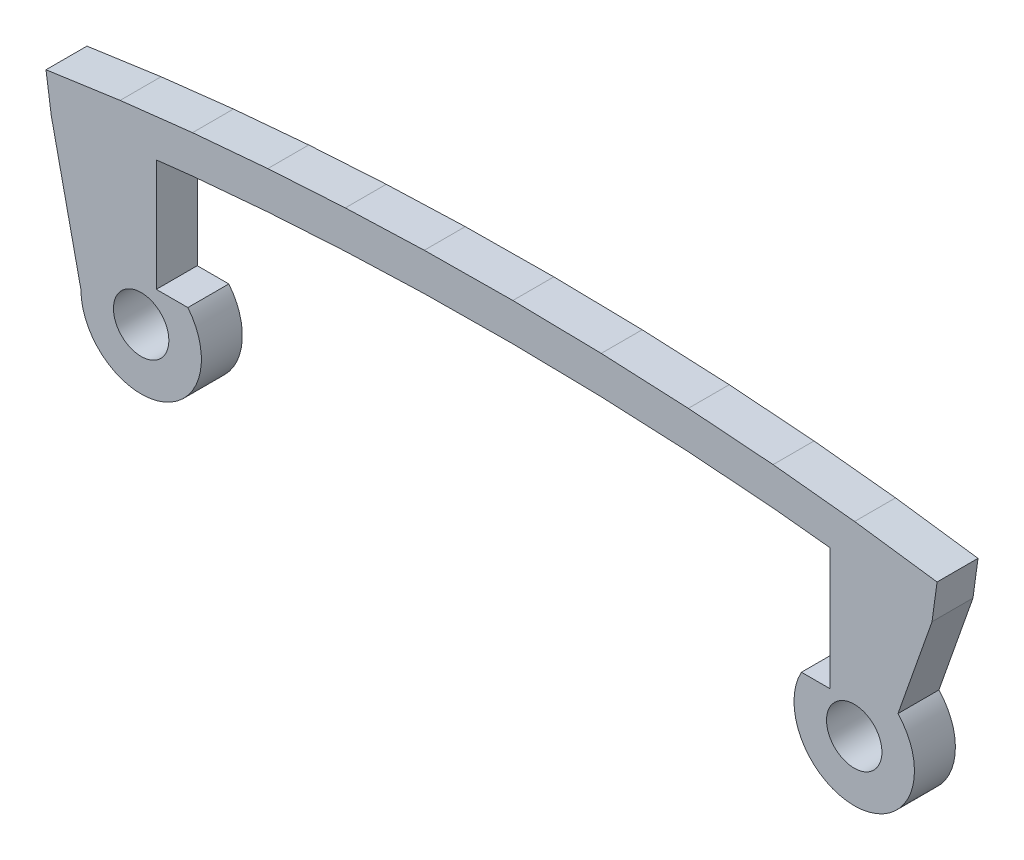
ISO-10303-21;
HEADER;
FILE_DESCRIPTION(('STEP AP214'),'2;1');
FILE_NAME('part.step','',(''),(''),'','','');
FILE_SCHEMA(('AUTOMOTIVE_DESIGN { 1 0 10303 214 1 1 1 1 }'));
ENDSEC;
DATA;
#1=APPLICATION_CONTEXT('core data for automotive mechanical design processes');
#2=APPLICATION_PROTOCOL_DEFINITION('international standard','automotive_design',2000,#1);
#3=PRODUCT_CONTEXT('',#1,'mechanical');
#4=PRODUCT('Part','Part','',(#3));
#5=PRODUCT_RELATED_PRODUCT_CATEGORY('part','',(#4));
#6=PRODUCT_DEFINITION_FORMATION('','',#4);
#7=PRODUCT_DEFINITION_CONTEXT('part definition',#1,'design');
#8=PRODUCT_DEFINITION('design','',#6,#7);
#9=PRODUCT_DEFINITION_SHAPE('','',#8);
#10=(LENGTH_UNIT() NAMED_UNIT(*) SI_UNIT(.MILLI.,.METRE.));
#11=(NAMED_UNIT(*) PLANE_ANGLE_UNIT() SI_UNIT($,.RADIAN.));
#12=(NAMED_UNIT(*) SI_UNIT($,.STERADIAN.) SOLID_ANGLE_UNIT());
#13=UNCERTAINTY_MEASURE_WITH_UNIT(LENGTH_MEASURE(1.E-05),#10,'distance_accuracy_value','');
#14=(GEOMETRIC_REPRESENTATION_CONTEXT(3) GLOBAL_UNCERTAINTY_ASSIGNED_CONTEXT((#13)) GLOBAL_UNIT_ASSIGNED_CONTEXT((#10,
#11,#12)) REPRESENTATION_CONTEXT('',''));
#15=CARTESIAN_POINT('',(0.,0.,0.));
#16=DIRECTION('',(0.,0.,1.));
#17=DIRECTION('',(1.,0.,0.));
#18=AXIS2_PLACEMENT_3D('',#15,#16,#17);
#19=CARTESIAN_POINT('',(-0.123345265688871,139.605502796736,161.523243341977));
#20=DIRECTION('',(0.,0.,1.));
#21=DIRECTION('',(1.,0.,0.));
#22=AXIS2_PLACEMENT_3D('',#19,#20,#21);
#23=PLANE('',#22);
#24=CARTESIAN_POINT('',(-0.123345265688871,139.605502796736,161.523243341977));
#25=DIRECTION('',(0.,0.,1.));
#26=DIRECTION('',(1.,0.,0.));
#27=AXIS2_PLACEMENT_3D('',#24,#25,#26);
#28=CIRCLE('',#27,1.15000024000001);
#29=CARTESIAN_POINT('',(1.02665497431114,139.605502796736,161.523243341977));
#30=VERTEX_POINT('',#29);
#31=EDGE_CURVE('E264',#30,#30,#28,.T.);
#32=ORIENTED_EDGE('',*,*,#31,.F.);
#33=EDGE_LOOP('',(#32));
#34=FACE_BOUND('',#33,.T.);
#35=CARTESIAN_POINT('',(-0.123345265688871,139.605502796736,161.523243341977));
#36=DIRECTION('',(0.,0.,1.));
#37=DIRECTION('',(1.,0.,0.));
#38=AXIS2_PLACEMENT_3D('',#35,#36,#37);
#39=CIRCLE('',#38,2.5);
#40=CARTESIAN_POINT('',(-2.31401490003765,140.810063527103,161.523243341977));
#41=VERTEX_POINT('',#40);
#42=CARTESIAN_POINT('',(1.69187692785862,141.324504945674,161.523243341977));
#43=VERTEX_POINT('',#42);
#44=EDGE_CURVE('E158',#41,#43,#39,.T.);
#45=ORIENTED_EDGE('',*,*,#44,.T.);
#46=DIRECTION('',(0.332723228899227,0.943024524045304,0.));
#47=VECTOR('',#46,1.);
#48=CARTESIAN_POINT('',(1.69187692785862,141.324504945674,161.523243341977));
#49=LINE('',#48,#47);
#50=CARTESIAN_POINT('',(3.10767961017012,145.337259495592,161.523243341977));
#51=VERTEX_POINT('',#50);
#52=EDGE_CURVE('E480',#43,#51,#49,.T.);
#53=ORIENTED_EDGE('',*,*,#52,.T.);
#54=DIRECTION('',(0.134081495211112,0.990970308658111,0.));
#55=VECTOR('',#54,1.);
#56=CARTESIAN_POINT('',(3.31491302084713,146.868881414183,161.523243341977));
#57=LINE('',#56,#55);
#58=CARTESIAN_POINT('',(3.31491302084713,146.868881414183,161.523243341977));
#59=VERTEX_POINT('',#58);
#60=EDGE_CURVE('E404',#51,#59,#57,.T.);
#61=ORIENTED_EDGE('',*,*,#60,.T.);
#62=DIRECTION('',(-0.990970308658111,0.134081495211111,0.));
#63=VECTOR('',#62,1.);
#64=CARTESIAN_POINT('',(-0.107320542417873,147.331920709221,161.523243341977));
#65=LINE('',#64,#63);
#66=CARTESIAN_POINT('',(-0.107320542417873,147.331920709221,161.523243341977));
#67=VERTEX_POINT('',#66);
#68=EDGE_CURVE('E422',#59,#67,#65,.T.);
#69=ORIENTED_EDGE('',*,*,#68,.T.);
#70=DIRECTION('',(-0.994603246043685,0.103751544370985,0.));
#71=VECTOR('',#70,1.);
#72=CARTESIAN_POINT('',(-1.12852764959982,147.438447422173,161.523243341977));
#73=LINE('',#72,#71);
#74=CARTESIAN_POINT('',(-3.49131941326687,147.684920873253,161.523243341977));
#75=VERTEX_POINT('',#74);
#76=EDGE_CURVE('E419',#67,#75,#73,.T.);
#77=ORIENTED_EDGE('',*,*,#76,.T.);
#78=DIRECTION('',(-0.997218826776755,0.0745292662112883,0.));
#79=VECTOR('',#78,1.);
#80=CARTESIAN_POINT('',(-7.01032042034687,147.947920884697,161.523243341977));
#81=LINE('',#80,#79);
#82=CARTESIAN_POINT('',(-7.01032042034687,147.947920884697,161.523243341977));
#83=VERTEX_POINT('',#82);
#84=EDGE_CURVE('E421',#75,#83,#81,.T.);
#85=ORIENTED_EDGE('',*,*,#84,.T.);
#86=DIRECTION('',(-0.998921870718915,0.046423013683116,0.));
#87=VECTOR('',#86,1.);
#88=CARTESIAN_POINT('',(-10.6253182841169,148.115921105949,161.523243341977));
#89=LINE('',#88,#87);
#90=CARTESIAN_POINT('',(-10.6253182841169,148.115921105949,161.523243341977));
#91=VERTEX_POINT('',#90);
#92=EDGE_CURVE('E424',#83,#91,#89,.T.);
#93=ORIENTED_EDGE('',*,*,#92,.T.);
#94=DIRECTION('',(-0.999828203436329,0.0185354690602007,0.));
#95=VECTOR('',#94,1.);
#96=CARTESIAN_POINT('',(-14.2933213663919,148.183920945732,161.523243341977));
#97=LINE('',#96,#95);
#98=CARTESIAN_POINT('',(-14.2933213663919,148.183920945732,161.523243341977));
#99=VERTEX_POINT('',#98);
#100=EDGE_CURVE('E430',#91,#99,#97,.T.);
#101=ORIENTED_EDGE('',*,*,#100,.T.);
#102=DIRECTION('',(-0.999959729721886,-0.0089743486968982,0.));
#103=VECTOR('',#102,1.);
#104=CARTESIAN_POINT('',(-17.9703195048199,148.150920953361,161.523243341977));
#105=LINE('',#104,#103);
#106=CARTESIAN_POINT('',(-17.9703195048199,148.150920953361,161.523243341977));
#107=VERTEX_POINT('',#106);
#108=EDGE_CURVE('E432',#99,#107,#105,.T.);
#109=ORIENTED_EDGE('',*,*,#108,.T.);
#110=DIRECTION('',(-0.999364017189702,-0.0356589560483776,0.));
#111=VECTOR('',#110,1.);
#112=CARTESIAN_POINT('',(-21.2493188334329,148.033920850365,161.523243341977));
#113=LINE('',#112,#111);
#114=CARTESIAN_POINT('',(-21.2493188334329,148.033920850365,161.523243341977));
#115=VERTEX_POINT('',#114);
#116=EDGE_CURVE('E434',#107,#115,#113,.T.);
#117=ORIENTED_EDGE('',*,*,#116,.T.);
#118=DIRECTION('',(-0.998167926705539,-0.0605044634416733,0.));
#119=VECTOR('',#118,1.);
#120=CARTESIAN_POINT('',(-24.4663197947369,147.838920678703,161.523243341977));
#121=LINE('',#120,#119);
#122=CARTESIAN_POINT('',(-24.4663197947369,147.838920678703,161.523243341977));
#123=VERTEX_POINT('',#122);
#124=EDGE_CURVE('E436',#115,#123,#121,.T.);
#125=ORIENTED_EDGE('',*,*,#124,.T.);
#126=DIRECTION('',(-0.996260899689949,-0.0863957160336895,0.));
#127=VECTOR('',#126,1.);
#128=CARTESIAN_POINT('',(-27.5913197947369,147.567920770256,161.523243341977));
#129=LINE('',#128,#127);
#130=CARTESIAN_POINT('',(-27.5913197947369,147.567920770256,161.523243341977));
#131=VERTEX_POINT('',#130);
#132=EDGE_CURVE('E438',#123,#131,#129,.T.);
#133=ORIENTED_EDGE('',*,*,#132,.T.);
#134=DIRECTION('',(-0.993585854220757,-0.113080282509412,0.));
#135=VECTOR('',#134,1.);
#136=CARTESIAN_POINT('',(-29.0938203287944,147.396920766442,161.523243341977));
#137=LINE('',#136,#135);
#138=CARTESIAN_POINT('',(-30.5963208628519,147.225920762627,161.523243341977));
#139=VERTEX_POINT('',#138);
#140=EDGE_CURVE('E440',#131,#139,#137,.T.);
#141=ORIENTED_EDGE('',*,*,#140,.T.);
#142=DIRECTION('',(-0.990073741432097,-0.140548875935203,0.));
#143=VECTOR('',#142,1.);
#144=CARTESIAN_POINT('',(-33.6733522826868,146.789111574405,161.523243341977));
#145=LINE('',#144,#143);
#146=CARTESIAN_POINT('',(-33.6733522826868,146.789111574405,161.523243341977));
#147=VERTEX_POINT('',#146);
#148=EDGE_CURVE('E442',#139,#147,#145,.T.);
#149=ORIENTED_EDGE('',*,*,#148,.T.);
#150=DIRECTION('',(0.140548875935203,-0.990073741432097,0.));
#151=VECTOR('',#150,1.);
#152=CARTESIAN_POINT('',(-33.4563195658549,145.260259831286,161.523243341977));
#153=LINE('',#152,#151);
#154=CARTESIAN_POINT('',(-33.4563195658549,145.260259831286,161.523243341977));
#155=VERTEX_POINT('',#154);
#156=EDGE_CURVE('E444',#147,#155,#153,.T.);
#157=ORIENTED_EDGE('',*,*,#156,.T.);
#158=DIRECTION('',(0.213039695138311,-0.977043544728368,0.));
#159=VECTOR('',#158,1.);
#160=CARTESIAN_POINT('',(-32.2233267056885,139.605502796736,161.523243341977));
#161=LINE('',#160,#159);
#162=CARTESIAN_POINT('',(-32.2233267056885,139.605502796736,161.523243341977));
#163=VERTEX_POINT('',#162);
#164=EDGE_CURVE('E446',#155,#163,#161,.T.);
#165=ORIENTED_EDGE('',*,*,#164,.T.);
#166=CARTESIAN_POINT('',(-29.7233267056889,139.605502796736,161.523243341977));
#167=DIRECTION('',(0.,0.,1.));
#168=DIRECTION('',(1.,0.,0.));
#169=AXIS2_PLACEMENT_3D('',#166,#167,#168);
#170=CIRCLE('',#169,2.50000000000026);
#171=CARTESIAN_POINT('',(-27.7845621351529,141.183853816007,161.523243341977));
#172=VERTEX_POINT('',#171);
#173=EDGE_CURVE('E448',#163,#172,#170,.T.);
#174=ORIENTED_EDGE('',*,*,#173,.T.);
#175=DIRECTION('',(-1.,0.,0.));
#176=VECTOR('',#175,1.);
#177=CARTESIAN_POINT('',(-27.7845621351524,141.183853816008,161.523243341977));
#178=LINE('',#177,#176);
#179=CARTESIAN_POINT('',(-29.0938203287944,141.183853816008,161.523243341977));
#180=VERTEX_POINT('',#179);
#181=EDGE_CURVE('E450',#172,#180,#178,.T.);
#182=ORIENTED_EDGE('',*,*,#181,.T.);
#183=DIRECTION('',(0.,1.,0.));
#184=VECTOR('',#183,1.);
#185=CARTESIAN_POINT('',(-29.0938203287944,141.183853816008,161.523243341977));
#186=LINE('',#185,#184);
#187=CARTESIAN_POINT('',(-29.0938203287944,145.837259495592,161.523243341977));
#188=VERTEX_POINT('',#187);
#189=EDGE_CURVE('E452',#180,#188,#186,.T.);
#190=ORIENTED_EDGE('',*,*,#189,.T.);
#191=DIRECTION('',(0.993585854220757,0.113080282509412,0.));
#192=VECTOR('',#191,1.);
#193=CARTESIAN_POINT('',(-29.0938203287944,145.837259495592,161.523243341977));
#194=LINE('',#193,#192);
#195=CARTESIAN_POINT('',(-27.5913197947369,146.008259499407,161.523243341977));
#196=VERTEX_POINT('',#195);
#197=EDGE_CURVE('E454',#188,#196,#194,.T.);
#198=ORIENTED_EDGE('',*,*,#197,.T.);
#199=DIRECTION('',(0.996260899689949,0.0863957160336896,0.));
#200=VECTOR('',#199,1.);
#201=CARTESIAN_POINT('',(-27.5913197947369,146.008259499407,161.523243341977));
#202=LINE('',#201,#200);
#203=CARTESIAN_POINT('',(-24.4663197947369,146.279259407854,161.523243341977));
#204=VERTEX_POINT('',#203);
#205=EDGE_CURVE('E456',#196,#204,#202,.T.);
#206=ORIENTED_EDGE('',*,*,#205,.T.);
#207=DIRECTION('',(0.998167926705539,0.0605044634416733,0.));
#208=VECTOR('',#207,1.);
#209=CARTESIAN_POINT('',(-24.4663197947369,146.279259407854,161.523243341977));
#210=LINE('',#209,#208);
#211=CARTESIAN_POINT('',(-21.2493188334329,146.474259579516,161.523243341977));
#212=VERTEX_POINT('',#211);
#213=EDGE_CURVE('E458',#204,#212,#210,.T.);
#214=ORIENTED_EDGE('',*,*,#213,.T.);
#215=DIRECTION('',(0.999364017189702,0.0356589560483776,0.));
#216=VECTOR('',#215,1.);
#217=CARTESIAN_POINT('',(-21.2493188334329,146.474259579516,161.523243341977));
#218=LINE('',#217,#216);
#219=CARTESIAN_POINT('',(-17.9703195048199,146.591259682512,161.523243341977));
#220=VERTEX_POINT('',#219);
#221=EDGE_CURVE('E460',#212,#220,#218,.T.);
#222=ORIENTED_EDGE('',*,*,#221,.T.);
#223=DIRECTION('',(0.999959729721886,0.0089743486968982,0.));
#224=VECTOR('',#223,1.);
#225=CARTESIAN_POINT('',(-17.9703195048199,146.591259682512,161.523243341977));
#226=LINE('',#225,#224);
#227=CARTESIAN_POINT('',(-14.2933213663919,146.624259674883,161.523243341977));
#228=VERTEX_POINT('',#227);
#229=EDGE_CURVE('E462',#220,#228,#226,.T.);
#230=ORIENTED_EDGE('',*,*,#229,.T.);
#231=DIRECTION('',(0.999828203436329,-0.0185354690602007,0.));
#232=VECTOR('',#231,1.);
#233=CARTESIAN_POINT('',(-14.2933213663919,146.624259674883,161.523243341977));
#234=LINE('',#233,#232);
#235=CARTESIAN_POINT('',(-10.6253182841169,146.5562598351,161.523243341977));
#236=VERTEX_POINT('',#235);
#237=EDGE_CURVE('E464',#228,#236,#234,.T.);
#238=ORIENTED_EDGE('',*,*,#237,.T.);
#239=DIRECTION('',(0.998921870718915,-0.046423013683116,0.));
#240=VECTOR('',#239,1.);
#241=CARTESIAN_POINT('',(-10.6253182841169,146.5562598351,161.523243341977));
#242=LINE('',#241,#240);
#243=CARTESIAN_POINT('',(-7.01032042034687,146.388259613848,161.523243341977));
#244=VERTEX_POINT('',#243);
#245=EDGE_CURVE('E466',#236,#244,#242,.T.);
#246=ORIENTED_EDGE('',*,*,#245,.T.);
#247=DIRECTION('',(0.997218826776755,-0.0745292662112883,0.));
#248=VECTOR('',#247,1.);
#249=CARTESIAN_POINT('',(-7.01032042034687,146.388259613848,161.523243341977));
#250=LINE('',#249,#248);
#251=CARTESIAN_POINT('',(-3.49131941326687,146.125259602404,161.523243341977));
#252=VERTEX_POINT('',#251);
#253=EDGE_CURVE('E244',#244,#252,#250,.T.);
#254=ORIENTED_EDGE('',*,*,#253,.T.);
#255=DIRECTION('',(0.994603246043687,-0.103751544370967,0.));
#256=VECTOR('',#255,1.);
#257=CARTESIAN_POINT('',(-3.49131941326687,146.125259602404,161.523243341977));
#258=LINE('',#257,#256);
#259=CARTESIAN_POINT('',(-1.12852764959982,145.878786151324,161.523243341977));
#260=VERTEX_POINT('',#259);
#261=EDGE_CURVE('E238',#252,#260,#258,.T.);
#262=ORIENTED_EDGE('',*,*,#261,.T.);
#263=DIRECTION('',(0.,-1.,0.));
#264=VECTOR('',#263,1.);
#265=CARTESIAN_POINT('',(-1.12852764959983,140.810063527103,161.523243341977));
#266=LINE('',#265,#264);
#267=CARTESIAN_POINT('',(-1.12852764959983,140.810063527103,161.523243341977));
#268=VERTEX_POINT('',#267);
#269=EDGE_CURVE('E242',#260,#268,#266,.T.);
#270=ORIENTED_EDGE('',*,*,#269,.T.);
#271=DIRECTION('',(-1.,0.,0.));
#272=VECTOR('',#271,1.);
#273=CARTESIAN_POINT('',(-1.12852764959983,140.810063527103,161.523243341977));
#274=LINE('',#273,#272);
#275=EDGE_CURVE('E50',#268,#41,#274,.T.);
#276=ORIENTED_EDGE('',*,*,#275,.T.);
#277=EDGE_LOOP('',(#45,#53,#61,#69,#77,#85,#93,#101,#109,#117,#125,#133,#141,#149,#157,#165,
#174,#182,#190,#198,#206,#214,#222,#230,#238,#246,#254,#262,#270,#276));
#278=FACE_BOUND('',#277,.T.);
#279=CARTESIAN_POINT('',(-29.7233267056889,139.605502796736,161.523243341977));
#280=DIRECTION('',(0.,0.,1.));
#281=DIRECTION('',(1.,0.,0.));
#282=AXIS2_PLACEMENT_3D('',#279,#280,#281);
#283=CIRCLE('',#282,1.15000024);
#284=CARTESIAN_POINT('',(-28.5733264656889,139.605502796736,161.523243341977));
#285=VERTEX_POINT('',#284);
#286=EDGE_CURVE('E815',#285,#285,#283,.T.);
#287=ORIENTED_EDGE('',*,*,#286,.F.);
#288=EDGE_LOOP('',(#287));
#289=FACE_BOUND('',#288,.T.);
#290=ADVANCED_FACE('F33',(#34,#278,#289),#23,.T.);
#291=CARTESIAN_POINT('',(-0.123345265688871,139.605502796736,159.823243341977));
#292=DIRECTION('',(0.,0.,1.));
#293=DIRECTION('',(1.,0.,0.));
#294=AXIS2_PLACEMENT_3D('',#291,#292,#293);
#295=PLANE('',#294);
#296=CARTESIAN_POINT('',(-0.123345265688871,139.605502796736,159.823243341977));
#297=DIRECTION('',(0.,0.,1.));
#298=DIRECTION('',(1.,0.,0.));
#299=AXIS2_PLACEMENT_3D('',#296,#297,#298);
#300=CIRCLE('',#299,2.5);
#301=CARTESIAN_POINT('',(-2.31401490003765,140.810063527103,159.823243341977));
#302=VERTEX_POINT('',#301);
#303=CARTESIAN_POINT('',(1.69187692785862,141.324504945674,159.823243341977));
#304=VERTEX_POINT('',#303);
#305=EDGE_CURVE('E152',#302,#304,#300,.T.);
#306=ORIENTED_EDGE('',*,*,#305,.F.);
#307=DIRECTION('',(-1.,0.,0.));
#308=VECTOR('',#307,1.);
#309=CARTESIAN_POINT('',(-1.12852764959983,140.810063527103,159.823243341977));
#310=LINE('',#309,#308);
#311=CARTESIAN_POINT('',(-1.12852764959983,140.810063527103,159.823243341977));
#312=VERTEX_POINT('',#311);
#313=EDGE_CURVE('E320',#312,#302,#310,.T.);
#314=ORIENTED_EDGE('',*,*,#313,.F.);
#315=DIRECTION('',(0.,-1.,0.));
#316=VECTOR('',#315,1.);
#317=CARTESIAN_POINT('',(-1.12852764959983,140.810063527103,159.823243341977));
#318=LINE('',#317,#316);
#319=CARTESIAN_POINT('',(-1.12852764959982,145.878786151324,159.823243341977));
#320=VERTEX_POINT('',#319);
#321=EDGE_CURVE('E145',#320,#312,#318,.T.);
#322=ORIENTED_EDGE('',*,*,#321,.F.);
#323=DIRECTION('',(0.994603246043687,-0.103751544370967,0.));
#324=VECTOR('',#323,1.);
#325=CARTESIAN_POINT('',(-3.49131941326687,146.125259602404,159.823243341977));
#326=LINE('',#325,#324);
#327=CARTESIAN_POINT('',(-3.49131941326687,146.125259602404,159.823243341977));
#328=VERTEX_POINT('',#327);
#329=EDGE_CURVE('E252',#328,#320,#326,.T.);
#330=ORIENTED_EDGE('',*,*,#329,.F.);
#331=DIRECTION('',(0.997218826776755,-0.0745292662112883,0.));
#332=VECTOR('',#331,1.);
#333=CARTESIAN_POINT('',(-7.01032042034687,146.388259613848,159.823243341977));
#334=LINE('',#333,#332);
#335=CARTESIAN_POINT('',(-7.01032042034687,146.388259613848,159.823243341977));
#336=VERTEX_POINT('',#335);
#337=EDGE_CURVE('E316',#336,#328,#334,.T.);
#338=ORIENTED_EDGE('',*,*,#337,.F.);
#339=DIRECTION('',(0.998921870718915,-0.046423013683116,0.));
#340=VECTOR('',#339,1.);
#341=CARTESIAN_POINT('',(-10.6253182841169,146.5562598351,159.823243341977));
#342=LINE('',#341,#340);
#343=CARTESIAN_POINT('',(-10.6253182841169,146.5562598351,159.823243341977));
#344=VERTEX_POINT('',#343);
#345=EDGE_CURVE('E314',#344,#336,#342,.T.);
#346=ORIENTED_EDGE('',*,*,#345,.F.);
#347=DIRECTION('',(0.999828203436329,-0.0185354690602007,0.));
#348=VECTOR('',#347,1.);
#349=CARTESIAN_POINT('',(-14.2933213663919,146.624259674883,159.823243341977));
#350=LINE('',#349,#348);
#351=CARTESIAN_POINT('',(-14.2933213663919,146.624259674883,159.823243341977));
#352=VERTEX_POINT('',#351);
#353=EDGE_CURVE('E312',#352,#344,#350,.T.);
#354=ORIENTED_EDGE('',*,*,#353,.F.);
#355=DIRECTION('',(0.999959729721886,0.0089743486968982,0.));
#356=VECTOR('',#355,1.);
#357=CARTESIAN_POINT('',(-17.9703195048199,146.591259682512,159.823243341977));
#358=LINE('',#357,#356);
#359=CARTESIAN_POINT('',(-17.9703195048199,146.591259682512,159.823243341977));
#360=VERTEX_POINT('',#359);
#361=EDGE_CURVE('E310',#360,#352,#358,.T.);
#362=ORIENTED_EDGE('',*,*,#361,.F.);
#363=DIRECTION('',(0.999364017189702,0.0356589560483776,0.));
#364=VECTOR('',#363,1.);
#365=CARTESIAN_POINT('',(-21.2493188334329,146.474259579516,159.823243341977));
#366=LINE('',#365,#364);
#367=CARTESIAN_POINT('',(-21.2493188334329,146.474259579516,159.823243341977));
#368=VERTEX_POINT('',#367);
#369=EDGE_CURVE('E308',#368,#360,#366,.T.);
#370=ORIENTED_EDGE('',*,*,#369,.F.);
#371=DIRECTION('',(0.998167926705539,0.0605044634416733,0.));
#372=VECTOR('',#371,1.);
#373=CARTESIAN_POINT('',(-24.4663197947369,146.279259407854,159.823243341977));
#374=LINE('',#373,#372);
#375=CARTESIAN_POINT('',(-24.4663197947369,146.279259407854,159.823243341977));
#376=VERTEX_POINT('',#375);
#377=EDGE_CURVE('E306',#376,#368,#374,.T.);
#378=ORIENTED_EDGE('',*,*,#377,.F.);
#379=DIRECTION('',(0.996260899689949,0.0863957160336896,0.));
#380=VECTOR('',#379,1.);
#381=CARTESIAN_POINT('',(-27.5913197947369,146.008259499407,159.823243341977));
#382=LINE('',#381,#380);
#383=CARTESIAN_POINT('',(-27.5913197947369,146.008259499407,159.823243341977));
#384=VERTEX_POINT('',#383);
#385=EDGE_CURVE('E304',#384,#376,#382,.T.);
#386=ORIENTED_EDGE('',*,*,#385,.F.);
#387=DIRECTION('',(0.993585854220757,0.113080282509412,0.));
#388=VECTOR('',#387,1.);
#389=CARTESIAN_POINT('',(-29.0938203287944,145.837259495592,159.823243341977));
#390=LINE('',#389,#388);
#391=CARTESIAN_POINT('',(-29.0938203287944,145.837259495592,159.823243341977));
#392=VERTEX_POINT('',#391);
#393=EDGE_CURVE('E302',#392,#384,#390,.T.);
#394=ORIENTED_EDGE('',*,*,#393,.F.);
#395=DIRECTION('',(0.,1.,0.));
#396=VECTOR('',#395,1.);
#397=CARTESIAN_POINT('',(-29.0938203287944,141.183853816008,159.823243341977));
#398=LINE('',#397,#396);
#399=CARTESIAN_POINT('',(-29.0938203287944,141.183853816008,159.823243341977));
#400=VERTEX_POINT('',#399);
#401=EDGE_CURVE('E300',#400,#392,#398,.T.);
#402=ORIENTED_EDGE('',*,*,#401,.F.);
#403=DIRECTION('',(-1.,0.,0.));
#404=VECTOR('',#403,1.);
#405=CARTESIAN_POINT('',(-27.7845621351524,141.183853816008,159.823243341977));
#406=LINE('',#405,#404);
#407=CARTESIAN_POINT('',(-27.7845621351529,141.183853816007,159.823243341977));
#408=VERTEX_POINT('',#407);
#409=EDGE_CURVE('E298',#408,#400,#406,.T.);
#410=ORIENTED_EDGE('',*,*,#409,.F.);
#411=CARTESIAN_POINT('',(-29.7233267056889,139.605502796736,159.823243341977));
#412=DIRECTION('',(0.,0.,1.));
#413=DIRECTION('',(1.,0.,0.));
#414=AXIS2_PLACEMENT_3D('',#411,#412,#413);
#415=CIRCLE('',#414,2.50000000000026);
#416=CARTESIAN_POINT('',(-32.2233267056885,139.605502796736,159.823243341977));
#417=VERTEX_POINT('',#416);
#418=EDGE_CURVE('E296',#417,#408,#415,.T.);
#419=ORIENTED_EDGE('',*,*,#418,.F.);
#420=DIRECTION('',(0.213039695138311,-0.977043544728368,0.));
#421=VECTOR('',#420,1.);
#422=CARTESIAN_POINT('',(-32.2233267056885,139.605502796736,159.823243341977));
#423=LINE('',#422,#421);
#424=CARTESIAN_POINT('',(-33.4563195658549,145.260259831286,159.823243341977));
#425=VERTEX_POINT('',#424);
#426=EDGE_CURVE('E294',#425,#417,#423,.T.);
#427=ORIENTED_EDGE('',*,*,#426,.F.);
#428=DIRECTION('',(0.140548875935203,-0.990073741432097,0.));
#429=VECTOR('',#428,1.);
#430=CARTESIAN_POINT('',(-33.4563195658549,145.260259831286,159.823243341977));
#431=LINE('',#430,#429);
#432=CARTESIAN_POINT('',(-33.6733522826868,146.789111574405,159.823243341977));
#433=VERTEX_POINT('',#432);
#434=EDGE_CURVE('E292',#433,#425,#431,.T.);
#435=ORIENTED_EDGE('',*,*,#434,.F.);
#436=DIRECTION('',(-0.990073741432097,-0.140548875935203,0.));
#437=VECTOR('',#436,1.);
#438=CARTESIAN_POINT('',(-33.6733522826868,146.789111574405,159.823243341977));
#439=LINE('',#438,#437);
#440=CARTESIAN_POINT('',(-30.5963208628519,147.225920762627,159.823243341977));
#441=VERTEX_POINT('',#440);
#442=EDGE_CURVE('E290',#441,#433,#439,.T.);
#443=ORIENTED_EDGE('',*,*,#442,.F.);
#444=DIRECTION('',(-0.993585854220759,-0.113080282509393,0.));
#445=VECTOR('',#444,1.);
#446=CARTESIAN_POINT('',(-30.5963208628519,147.225920762627,159.823243341977));
#447=LINE('',#446,#445);
#448=CARTESIAN_POINT('',(-27.5913197947369,147.567920770256,159.823243341977));
#449=VERTEX_POINT('',#448);
#450=EDGE_CURVE('E288',#449,#441,#447,.T.);
#451=ORIENTED_EDGE('',*,*,#450,.F.);
#452=DIRECTION('',(-0.996260899689949,-0.0863957160336895,0.));
#453=VECTOR('',#452,1.);
#454=CARTESIAN_POINT('',(-27.5913197947369,147.567920770256,159.823243341977));
#455=LINE('',#454,#453);
#456=CARTESIAN_POINT('',(-24.4663197947369,147.838920678703,159.823243341977));
#457=VERTEX_POINT('',#456);
#458=EDGE_CURVE('E285',#457,#449,#455,.T.);
#459=ORIENTED_EDGE('',*,*,#458,.F.);
#460=DIRECTION('',(-0.998167926705539,-0.0605044634416733,0.));
#461=VECTOR('',#460,1.);
#462=CARTESIAN_POINT('',(-24.4663197947369,147.838920678703,159.823243341977));
#463=LINE('',#462,#461);
#464=CARTESIAN_POINT('',(-21.2493188334329,148.033920850365,159.823243341977));
#465=VERTEX_POINT('',#464);
#466=EDGE_CURVE('E283',#465,#457,#463,.T.);
#467=ORIENTED_EDGE('',*,*,#466,.F.);
#468=DIRECTION('',(-0.999364017189702,-0.0356589560483776,0.));
#469=VECTOR('',#468,1.);
#470=CARTESIAN_POINT('',(-21.2493188334329,148.033920850365,159.823243341977));
#471=LINE('',#470,#469);
#472=CARTESIAN_POINT('',(-17.9703195048199,148.150920953361,159.823243341977));
#473=VERTEX_POINT('',#472);
#474=EDGE_CURVE('E281',#473,#465,#471,.T.);
#475=ORIENTED_EDGE('',*,*,#474,.F.);
#476=DIRECTION('',(-0.999959729721886,-0.0089743486968982,0.));
#477=VECTOR('',#476,1.);
#478=CARTESIAN_POINT('',(-17.9703195048199,148.150920953361,159.823243341977));
#479=LINE('',#478,#477);
#480=CARTESIAN_POINT('',(-14.2933213663919,148.183920945732,159.823243341977));
#481=VERTEX_POINT('',#480);
#482=EDGE_CURVE('E279',#481,#473,#479,.T.);
#483=ORIENTED_EDGE('',*,*,#482,.F.);
#484=DIRECTION('',(-0.999828203436329,0.0185354690602007,0.));
#485=VECTOR('',#484,1.);
#486=CARTESIAN_POINT('',(-14.2933213663919,148.183920945732,159.823243341977));
#487=LINE('',#486,#485);
#488=CARTESIAN_POINT('',(-10.6253182841169,148.115921105949,159.823243341977));
#489=VERTEX_POINT('',#488);
#490=EDGE_CURVE('E277',#489,#481,#487,.T.);
#491=ORIENTED_EDGE('',*,*,#490,.F.);
#492=DIRECTION('',(-0.998921870718915,0.046423013683116,0.));
#493=VECTOR('',#492,1.);
#494=CARTESIAN_POINT('',(-10.6253182841169,148.115921105949,159.823243341977));
#495=LINE('',#494,#493);
#496=CARTESIAN_POINT('',(-7.01032042034687,147.947920884697,159.823243341977));
#497=VERTEX_POINT('',#496);
#498=EDGE_CURVE('E275',#497,#489,#495,.T.);
#499=ORIENTED_EDGE('',*,*,#498,.F.);
#500=DIRECTION('',(-0.997218826776755,0.0745292662112883,0.));
#501=VECTOR('',#500,1.);
#502=CARTESIAN_POINT('',(-7.01032042034687,147.947920884697,159.823243341977));
#503=LINE('',#502,#501);
#504=CARTESIAN_POINT('',(-3.49131941326687,147.684920873253,159.823243341977));
#505=VERTEX_POINT('',#504);
#506=EDGE_CURVE('E273',#505,#497,#503,.T.);
#507=ORIENTED_EDGE('',*,*,#506,.F.);
#508=DIRECTION('',(-0.994603246043687,0.103751544370967,0.));
#509=VECTOR('',#508,1.);
#510=CARTESIAN_POINT('',(-3.49131941326687,147.684920873253,159.823243341977));
#511=LINE('',#510,#509);
#512=CARTESIAN_POINT('',(-0.107320542417873,147.331920709221,159.823243341977));
#513=VERTEX_POINT('',#512);
#514=EDGE_CURVE('E271',#513,#505,#511,.T.);
#515=ORIENTED_EDGE('',*,*,#514,.F.);
#516=DIRECTION('',(-0.990970308658111,0.134081495211111,0.));
#517=VECTOR('',#516,1.);
#518=CARTESIAN_POINT('',(-0.107320542417873,147.331920709221,159.823243341977));
#519=LINE('',#518,#517);
#520=CARTESIAN_POINT('',(3.31491302084713,146.868881414183,159.823243341977));
#521=VERTEX_POINT('',#520);
#522=EDGE_CURVE('E268',#521,#513,#519,.T.);
#523=ORIENTED_EDGE('',*,*,#522,.F.);
#524=DIRECTION('',(0.134081495211112,0.990970308658111,0.));
#525=VECTOR('',#524,1.);
#526=CARTESIAN_POINT('',(3.31491302084713,146.868881414183,159.823243341977));
#527=LINE('',#526,#525);
#528=CARTESIAN_POINT('',(3.10767961017012,145.337259495592,159.823243341977));
#529=VERTEX_POINT('',#528);
#530=EDGE_CURVE('E266',#529,#521,#527,.T.);
#531=ORIENTED_EDGE('',*,*,#530,.F.);
#532=DIRECTION('',(0.332723228899227,0.943024524045304,0.));
#533=VECTOR('',#532,1.);
#534=CARTESIAN_POINT('',(1.69187692785862,141.324504945674,159.823243341977));
#535=LINE('',#534,#533);
#536=EDGE_CURVE('E263',#304,#529,#535,.T.);
#537=ORIENTED_EDGE('',*,*,#536,.F.);
#538=EDGE_LOOP('',(#306,#314,#322,#330,#338,#346,#354,#362,#370,#378,#386,#394,#402,#410,#419,
#427,#435,#443,#451,#459,#467,#475,#483,#491,#499,#507,#515,#523,#531,#537));
#539=FACE_BOUND('',#538,.T.);
#540=CARTESIAN_POINT('',(-0.123345265688871,139.605502796736,159.823243341977));
#541=DIRECTION('',(0.,0.,1.));
#542=DIRECTION('',(1.,0.,0.));
#543=AXIS2_PLACEMENT_3D('',#540,#541,#542);
#544=CIRCLE('',#543,1.15000024000001);
#545=CARTESIAN_POINT('',(1.02665497431114,139.605502796736,159.823243341977));
#546=VERTEX_POINT('',#545);
#547=EDGE_CURVE('E484',#546,#546,#544,.T.);
#548=ORIENTED_EDGE('',*,*,#547,.T.);
#549=EDGE_LOOP('',(#548));
#550=FACE_BOUND('',#549,.T.);
#551=CARTESIAN_POINT('',(-29.7233267056889,139.605502796736,159.823243341977));
#552=DIRECTION('',(0.,0.,1.));
#553=DIRECTION('',(1.,0.,0.));
#554=AXIS2_PLACEMENT_3D('',#551,#552,#553);
#555=CIRCLE('',#554,1.15000024);
#556=CARTESIAN_POINT('',(-28.5733264656889,139.605502796736,159.823243341977));
#557=VERTEX_POINT('',#556);
#558=EDGE_CURVE('E818',#557,#557,#555,.T.);
#559=ORIENTED_EDGE('',*,*,#558,.T.);
#560=EDGE_LOOP('',(#559));
#561=FACE_BOUND('',#560,.T.);
#562=ADVANCED_FACE('F408',(#539,#550,#561),#295,.F.);
#563=CARTESIAN_POINT('',(-0.123345265688871,139.605502796736,161.523243341977));
#564=DIRECTION('',(0.,0.,-1.));
#565=DIRECTION('',(-1.,0.,0.));
#566=AXIS2_PLACEMENT_3D('',#563,#564,#565);
#567=CYLINDRICAL_SURFACE('',#566,2.5);
#568=ORIENTED_EDGE('',*,*,#305,.T.);
#569=DIRECTION('',(0.,0.,-1.));
#570=VECTOR('',#569,1.);
#571=CARTESIAN_POINT('',(1.69187692785862,141.324504945674,161.523243341977));
#572=LINE('',#571,#570);
#573=EDGE_CURVE('E11',#43,#304,#572,.T.);
#574=ORIENTED_EDGE('',*,*,#573,.F.);
#575=ORIENTED_EDGE('',*,*,#44,.F.);
#576=DIRECTION('',(0.,0.,-1.));
#577=VECTOR('',#576,1.);
#578=CARTESIAN_POINT('',(-2.31401490003765,140.810063527103,161.523243341977));
#579=LINE('',#578,#577);
#580=EDGE_CURVE('E258',#41,#302,#579,.T.);
#581=ORIENTED_EDGE('',*,*,#580,.T.);
#582=EDGE_LOOP('',(#568,#574,#575,#581));
#583=FACE_BOUND('',#582,.T.);
#584=ADVANCED_FACE('F35',(#583),#567,.T.);
#585=CARTESIAN_POINT('',(1.69187692785862,141.324504945674,161.523243341977));
#586=DIRECTION('',(-0.943024524045304,0.332723228899227,0.));
#587=DIRECTION('',(-0.332723228899227,-0.943024524045304,0.));
#588=AXIS2_PLACEMENT_3D('',#585,#586,#587);
#589=PLANE('',#588);
#590=ORIENTED_EDGE('',*,*,#536,.T.);
#591=DIRECTION('',(0.,0.,-1.));
#592=VECTOR('',#591,1.);
#593=CARTESIAN_POINT('',(3.10767961017012,145.337259495592,161.523243341977));
#594=LINE('',#593,#592);
#595=EDGE_CURVE('E42',#51,#529,#594,.T.);
#596=ORIENTED_EDGE('',*,*,#595,.F.);
#597=ORIENTED_EDGE('',*,*,#52,.F.);
#598=ORIENTED_EDGE('',*,*,#573,.T.);
#599=EDGE_LOOP('',(#590,#596,#597,#598));
#600=FACE_BOUND('',#599,.T.);
#601=ADVANCED_FACE('F486',(#600),#589,.F.);
#602=CARTESIAN_POINT('',(3.31491302084713,146.868881414183,161.523243341977));
#603=DIRECTION('',(-0.990970308658111,0.134081495211113,0.));
#604=DIRECTION('',(-0.134081495211113,-0.990970308658111,0.));
#605=AXIS2_PLACEMENT_3D('',#602,#603,#604);
#606=PLANE('',#605);
#607=ORIENTED_EDGE('',*,*,#530,.T.);
#608=DIRECTION('',(0.,0.,-1.));
#609=VECTOR('',#608,1.);
#610=CARTESIAN_POINT('',(3.31491302084713,146.868881414183,161.523243341977));
#611=LINE('',#610,#609);
#612=EDGE_CURVE('E395',#59,#521,#611,.T.);
#613=ORIENTED_EDGE('',*,*,#612,.F.);
#614=ORIENTED_EDGE('',*,*,#60,.F.);
#615=ORIENTED_EDGE('',*,*,#595,.T.);
#616=EDGE_LOOP('',(#607,#613,#614,#615));
#617=FACE_BOUND('',#616,.T.);
#618=ADVANCED_FACE('F402',(#617),#606,.F.);
#619=CARTESIAN_POINT('',(-0.107320542417873,147.331920709221,161.523243341977));
#620=DIRECTION('',(-0.134081495211111,-0.990970308658111,0.));
#621=DIRECTION('',(0.990970308658112,-0.134081495211111,0.));
#622=AXIS2_PLACEMENT_3D('',#619,#620,#621);
#623=PLANE('',#622);
#624=ORIENTED_EDGE('',*,*,#522,.T.);
#625=DIRECTION('',(0.,0.,-1.));
#626=VECTOR('',#625,1.);
#627=CARTESIAN_POINT('',(-0.107320542417873,147.331920709221,161.523243341977));
#628=LINE('',#627,#626);
#629=EDGE_CURVE('E392',#67,#513,#628,.T.);
#630=ORIENTED_EDGE('',*,*,#629,.F.);
#631=ORIENTED_EDGE('',*,*,#68,.F.);
#632=ORIENTED_EDGE('',*,*,#612,.T.);
#633=EDGE_LOOP('',(#624,#630,#631,#632));
#634=FACE_BOUND('',#633,.T.);
#635=ADVANCED_FACE('F413',(#634),#623,.F.);
#636=CARTESIAN_POINT('',(-3.49131941326687,147.684920873253,161.523243341977));
#637=DIRECTION('',(-0.103751544370967,-0.994603246043687,0.));
#638=DIRECTION('',(0.994603246043687,-0.103751544370967,0.));
#639=AXIS2_PLACEMENT_3D('',#636,#637,#638);
#640=PLANE('',#639);
#641=ORIENTED_EDGE('',*,*,#514,.T.);
#642=DIRECTION('',(0.,0.,-1.));
#643=VECTOR('',#642,1.);
#644=CARTESIAN_POINT('',(-3.49131941326687,147.684920873253,161.523243341977));
#645=LINE('',#644,#643);
#646=EDGE_CURVE('E389',#75,#505,#645,.T.);
#647=ORIENTED_EDGE('',*,*,#646,.F.);
#648=ORIENTED_EDGE('',*,*,#76,.F.);
#649=ORIENTED_EDGE('',*,*,#629,.T.);
#650=EDGE_LOOP('',(#641,#647,#648,#649));
#651=FACE_BOUND('',#650,.T.);
#652=ADVANCED_FACE('F417',(#651),#640,.F.);
#653=CARTESIAN_POINT('',(-7.01032042034687,147.947920884697,161.523243341977));
#654=DIRECTION('',(-0.0745292662112883,-0.997218826776755,0.));
#655=DIRECTION('',(0.997218826776755,-0.0745292662112883,0.));
#656=AXIS2_PLACEMENT_3D('',#653,#654,#655);
#657=PLANE('',#656);
#658=ORIENTED_EDGE('',*,*,#506,.T.);
#659=DIRECTION('',(0.,0.,-1.));
#660=VECTOR('',#659,1.);
#661=CARTESIAN_POINT('',(-7.01032042034687,147.947920884697,161.523243341977));
#662=LINE('',#661,#660);
#663=EDGE_CURVE('E386',#83,#497,#662,.T.);
#664=ORIENTED_EDGE('',*,*,#663,.F.);
#665=ORIENTED_EDGE('',*,*,#84,.F.);
#666=ORIENTED_EDGE('',*,*,#646,.T.);
#667=EDGE_LOOP('',(#658,#664,#665,#666));
#668=FACE_BOUND('',#667,.T.);
#669=ADVANCED_FACE('F590',(#668),#657,.F.);
#670=CARTESIAN_POINT('',(-10.6253182841169,148.115921105949,161.523243341977));
#671=DIRECTION('',(-0.046423013683116,-0.998921870718915,0.));
#672=DIRECTION('',(0.998921870718915,-0.046423013683116,0.));
#673=AXIS2_PLACEMENT_3D('',#670,#671,#672);
#674=PLANE('',#673);
#675=ORIENTED_EDGE('',*,*,#498,.T.);
#676=DIRECTION('',(0.,0.,-1.));
#677=VECTOR('',#676,1.);
#678=CARTESIAN_POINT('',(-10.6253182841169,148.115921105949,161.523243341977));
#679=LINE('',#678,#677);
#680=EDGE_CURVE('E383',#91,#489,#679,.T.);
#681=ORIENTED_EDGE('',*,*,#680,.F.);
#682=ORIENTED_EDGE('',*,*,#92,.F.);
#683=ORIENTED_EDGE('',*,*,#663,.T.);
#684=EDGE_LOOP('',(#675,#681,#682,#683));
#685=FACE_BOUND('',#684,.T.);
#686=ADVANCED_FACE('F586',(#685),#674,.F.);
#687=CARTESIAN_POINT('',(-14.2933213663919,148.183920945732,161.523243341977));
#688=DIRECTION('',(-0.0185354690602007,-0.99982820343633,0.));
#689=DIRECTION('',(0.99982820343633,-0.0185354690602007,0.));
#690=AXIS2_PLACEMENT_3D('',#687,#688,#689);
#691=PLANE('',#690);
#692=ORIENTED_EDGE('',*,*,#490,.T.);
#693=DIRECTION('',(0.,0.,-1.));
#694=VECTOR('',#693,1.);
#695=CARTESIAN_POINT('',(-14.2933213663919,148.183920945732,161.523243341977));
#696=LINE('',#695,#694);
#697=EDGE_CURVE('E380',#99,#481,#696,.T.);
#698=ORIENTED_EDGE('',*,*,#697,.F.);
#699=ORIENTED_EDGE('',*,*,#100,.F.);
#700=ORIENTED_EDGE('',*,*,#680,.T.);
#701=EDGE_LOOP('',(#692,#698,#699,#700));
#702=FACE_BOUND('',#701,.T.);
#703=ADVANCED_FACE('F582',(#702),#691,.F.);
#704=CARTESIAN_POINT('',(-17.9703195048199,148.150920953361,161.523243341977));
#705=DIRECTION('',(0.0089743486968982,-0.999959729721886,0.));
#706=DIRECTION('',(0.999959729721886,0.0089743486968982,0.));
#707=AXIS2_PLACEMENT_3D('',#704,#705,#706);
#708=PLANE('',#707);
#709=ORIENTED_EDGE('',*,*,#482,.T.);
#710=DIRECTION('',(0.,0.,-1.));
#711=VECTOR('',#710,1.);
#712=CARTESIAN_POINT('',(-17.9703195048199,148.150920953361,161.523243341977));
#713=LINE('',#712,#711);
#714=EDGE_CURVE('E377',#107,#473,#713,.T.);
#715=ORIENTED_EDGE('',*,*,#714,.F.);
#716=ORIENTED_EDGE('',*,*,#108,.F.);
#717=ORIENTED_EDGE('',*,*,#697,.T.);
#718=EDGE_LOOP('',(#709,#715,#716,#717));
#719=FACE_BOUND('',#718,.T.);
#720=ADVANCED_FACE('F578',(#719),#708,.F.);
#721=CARTESIAN_POINT('',(-21.2493188334329,148.033920850365,161.523243341977));
#722=DIRECTION('',(0.0356589560483776,-0.999364017189702,0.));
#723=DIRECTION('',(0.999364017189702,0.0356589560483776,0.));
#724=AXIS2_PLACEMENT_3D('',#721,#722,#723);
#725=PLANE('',#724);
#726=ORIENTED_EDGE('',*,*,#474,.T.);
#727=DIRECTION('',(0.,0.,-1.));
#728=VECTOR('',#727,1.);
#729=CARTESIAN_POINT('',(-21.2493188334329,148.033920850365,161.523243341977));
#730=LINE('',#729,#728);
#731=EDGE_CURVE('E374',#115,#465,#730,.T.);
#732=ORIENTED_EDGE('',*,*,#731,.F.);
#733=ORIENTED_EDGE('',*,*,#116,.F.);
#734=ORIENTED_EDGE('',*,*,#714,.T.);
#735=EDGE_LOOP('',(#726,#732,#733,#734));
#736=FACE_BOUND('',#735,.T.);
#737=ADVANCED_FACE('F574',(#736),#725,.F.);
#738=CARTESIAN_POINT('',(-24.4663197947369,147.838920678703,161.523243341977));
#739=DIRECTION('',(0.0605044634416734,-0.99816792670554,0.));
#740=DIRECTION('',(0.99816792670554,0.0605044634416734,0.));
#741=AXIS2_PLACEMENT_3D('',#738,#739,#740);
#742=PLANE('',#741);
#743=ORIENTED_EDGE('',*,*,#466,.T.);
#744=DIRECTION('',(0.,0.,-1.));
#745=VECTOR('',#744,1.);
#746=CARTESIAN_POINT('',(-24.4663197947369,147.838920678703,161.523243341977));
#747=LINE('',#746,#745);
#748=EDGE_CURVE('E371',#123,#457,#747,.T.);
#749=ORIENTED_EDGE('',*,*,#748,.F.);
#750=ORIENTED_EDGE('',*,*,#124,.F.);
#751=ORIENTED_EDGE('',*,*,#731,.T.);
#752=EDGE_LOOP('',(#743,#749,#750,#751));
#753=FACE_BOUND('',#752,.T.);
#754=ADVANCED_FACE('F570',(#753),#742,.F.);
#755=CARTESIAN_POINT('',(-27.5913197947369,147.567920770256,161.523243341977));
#756=DIRECTION('',(0.0863957160336895,-0.996260899689949,0.));
#757=DIRECTION('',(0.996260899689949,0.0863957160336895,0.));
#758=AXIS2_PLACEMENT_3D('',#755,#756,#757);
#759=PLANE('',#758);
#760=ORIENTED_EDGE('',*,*,#458,.T.);
#761=DIRECTION('',(0.,0.,-1.));
#762=VECTOR('',#761,1.);
#763=CARTESIAN_POINT('',(-27.5913197947369,147.567920770256,161.523243341977));
#764=LINE('',#763,#762);
#765=EDGE_CURVE('E368',#131,#449,#764,.T.);
#766=ORIENTED_EDGE('',*,*,#765,.F.);
#767=ORIENTED_EDGE('',*,*,#132,.F.);
#768=ORIENTED_EDGE('',*,*,#748,.T.);
#769=EDGE_LOOP('',(#760,#766,#767,#768));
#770=FACE_BOUND('',#769,.T.);
#771=ADVANCED_FACE('F566',(#770),#759,.F.);
#772=CARTESIAN_POINT('',(-30.5963208628519,147.225920762627,161.523243341977));
#773=DIRECTION('',(0.113080282509393,-0.993585854220759,0.));
#774=DIRECTION('',(0.993585854220759,0.113080282509393,0.));
#775=AXIS2_PLACEMENT_3D('',#772,#773,#774);
#776=PLANE('',#775);
#777=ORIENTED_EDGE('',*,*,#450,.T.);
#778=DIRECTION('',(0.,0.,-1.));
#779=VECTOR('',#778,1.);
#780=CARTESIAN_POINT('',(-30.5963208628519,147.225920762627,161.523243341977));
#781=LINE('',#780,#779);
#782=EDGE_CURVE('E365',#139,#441,#781,.T.);
#783=ORIENTED_EDGE('',*,*,#782,.F.);
#784=ORIENTED_EDGE('',*,*,#140,.F.);
#785=ORIENTED_EDGE('',*,*,#765,.T.);
#786=EDGE_LOOP('',(#777,#783,#784,#785));
#787=FACE_BOUND('',#786,.T.);
#788=ADVANCED_FACE('F562',(#787),#776,.F.);
#789=CARTESIAN_POINT('',(-33.6733522826868,146.789111574405,161.523243341977));
#790=DIRECTION('',(0.140548875935203,-0.990073741432097,0.));
#791=DIRECTION('',(0.990073741432097,0.140548875935203,0.));
#792=AXIS2_PLACEMENT_3D('',#789,#790,#791);
#793=PLANE('',#792);
#794=ORIENTED_EDGE('',*,*,#442,.T.);
#795=DIRECTION('',(0.,0.,-1.));
#796=VECTOR('',#795,1.);
#797=CARTESIAN_POINT('',(-33.6733522826868,146.789111574405,161.523243341977));
#798=LINE('',#797,#796);
#799=EDGE_CURVE('E362',#147,#433,#798,.T.);
#800=ORIENTED_EDGE('',*,*,#799,.F.);
#801=ORIENTED_EDGE('',*,*,#148,.F.);
#802=ORIENTED_EDGE('',*,*,#782,.T.);
#803=EDGE_LOOP('',(#794,#800,#801,#802));
#804=FACE_BOUND('',#803,.T.);
#805=ADVANCED_FACE('F558',(#804),#793,.F.);
#806=CARTESIAN_POINT('',(-33.4563195658549,145.260259831286,161.523243341977));
#807=DIRECTION('',(0.990073741432097,0.140548875935203,0.));
#808=DIRECTION('',(-0.140548875935203,0.990073741432097,0.));
#809=AXIS2_PLACEMENT_3D('',#806,#807,#808);
#810=PLANE('',#809);
#811=ORIENTED_EDGE('',*,*,#434,.T.);
#812=DIRECTION('',(0.,0.,-1.));
#813=VECTOR('',#812,1.);
#814=CARTESIAN_POINT('',(-33.4563195658549,145.260259831286,161.523243341977));
#815=LINE('',#814,#813);
#816=EDGE_CURVE('E359',#155,#425,#815,.T.);
#817=ORIENTED_EDGE('',*,*,#816,.F.);
#818=ORIENTED_EDGE('',*,*,#156,.F.);
#819=ORIENTED_EDGE('',*,*,#799,.T.);
#820=EDGE_LOOP('',(#811,#817,#818,#819));
#821=FACE_BOUND('',#820,.T.);
#822=ADVANCED_FACE('F554',(#821),#810,.F.);
#823=CARTESIAN_POINT('',(-32.2233267056885,139.605502796736,161.523243341977));
#824=DIRECTION('',(0.977043544728369,0.213039695138311,0.));
#825=DIRECTION('',(-0.213039695138311,0.977043544728369,0.));
#826=AXIS2_PLACEMENT_3D('',#823,#824,#825);
#827=PLANE('',#826);
#828=ORIENTED_EDGE('',*,*,#426,.T.);
#829=DIRECTION('',(0.,0.,-1.));
#830=VECTOR('',#829,1.);
#831=CARTESIAN_POINT('',(-32.2233267056885,139.605502796736,161.523243341977));
#832=LINE('',#831,#830);
#833=EDGE_CURVE('E356',#163,#417,#832,.T.);
#834=ORIENTED_EDGE('',*,*,#833,.F.);
#835=ORIENTED_EDGE('',*,*,#164,.F.);
#836=ORIENTED_EDGE('',*,*,#816,.T.);
#837=EDGE_LOOP('',(#828,#834,#835,#836));
#838=FACE_BOUND('',#837,.T.);
#839=ADVANCED_FACE('F550',(#838),#827,.F.);
#840=CARTESIAN_POINT('',(-29.7233267056889,139.605502796736,161.523243341977));
#841=DIRECTION('',(0.,0.,-1.));
#842=DIRECTION('',(-1.,0.,0.));
#843=AXIS2_PLACEMENT_3D('',#840,#841,#842);
#844=CYLINDRICAL_SURFACE('',#843,2.50000000000026);
#845=ORIENTED_EDGE('',*,*,#418,.T.);
#846=DIRECTION('',(0.,0.,-1.));
#847=VECTOR('',#846,1.);
#848=CARTESIAN_POINT('',(-27.7845621351529,141.183853816007,161.523243341977));
#849=LINE('',#848,#847);
#850=EDGE_CURVE('E353',#172,#408,#849,.T.);
#851=ORIENTED_EDGE('',*,*,#850,.F.);
#852=ORIENTED_EDGE('',*,*,#173,.F.);
#853=ORIENTED_EDGE('',*,*,#833,.T.);
#854=EDGE_LOOP('',(#845,#851,#852,#853));
#855=FACE_BOUND('',#854,.T.);
#856=ADVANCED_FACE('F546',(#855),#844,.T.);
#857=CARTESIAN_POINT('',(-27.7845621351524,141.183853816008,161.523243341977));
#858=DIRECTION('',(0.,-1.,0.));
#859=DIRECTION('',(0.,0.,-1.));
#860=AXIS2_PLACEMENT_3D('',#857,#858,#859);
#861=PLANE('',#860);
#862=ORIENTED_EDGE('',*,*,#409,.T.);
#863=DIRECTION('',(0.,0.,-1.));
#864=VECTOR('',#863,1.);
#865=CARTESIAN_POINT('',(-29.0938203287944,141.183853816008,161.523243341977));
#866=LINE('',#865,#864);
#867=EDGE_CURVE('E350',#180,#400,#866,.T.);
#868=ORIENTED_EDGE('',*,*,#867,.F.);
#869=ORIENTED_EDGE('',*,*,#181,.F.);
#870=ORIENTED_EDGE('',*,*,#850,.T.);
#871=EDGE_LOOP('',(#862,#868,#869,#870));
#872=FACE_BOUND('',#871,.T.);
#873=ADVANCED_FACE('F542',(#872),#861,.F.);
#874=CARTESIAN_POINT('',(-29.0938203287944,141.183853816008,161.523243341977));
#875=DIRECTION('',(-1.,0.,0.));
#876=DIRECTION('',(0.,0.,1.));
#877=AXIS2_PLACEMENT_3D('',#874,#875,#876);
#878=PLANE('',#877);
#879=ORIENTED_EDGE('',*,*,#401,.T.);
#880=DIRECTION('',(0.,0.,-1.));
#881=VECTOR('',#880,1.);
#882=CARTESIAN_POINT('',(-29.0938203287944,145.837259495592,161.523243341977));
#883=LINE('',#882,#881);
#884=EDGE_CURVE('E347',#188,#392,#883,.T.);
#885=ORIENTED_EDGE('',*,*,#884,.F.);
#886=ORIENTED_EDGE('',*,*,#189,.F.);
#887=ORIENTED_EDGE('',*,*,#867,.T.);
#888=EDGE_LOOP('',(#879,#885,#886,#887));
#889=FACE_BOUND('',#888,.T.);
#890=ADVANCED_FACE('F538',(#889),#878,.F.);
#891=CARTESIAN_POINT('',(-29.0938203287944,145.837259495592,161.523243341977));
#892=DIRECTION('',(-0.113080282509412,0.993585854220757,0.));
#893=DIRECTION('',(-0.993585854220757,-0.113080282509412,0.));
#894=AXIS2_PLACEMENT_3D('',#891,#892,#893);
#895=PLANE('',#894);
#896=ORIENTED_EDGE('',*,*,#393,.T.);
#897=DIRECTION('',(0.,0.,-1.));
#898=VECTOR('',#897,1.);
#899=CARTESIAN_POINT('',(-27.5913197947369,146.008259499407,161.523243341977));
#900=LINE('',#899,#898);
#901=EDGE_CURVE('E344',#196,#384,#900,.T.);
#902=ORIENTED_EDGE('',*,*,#901,.F.);
#903=ORIENTED_EDGE('',*,*,#197,.F.);
#904=ORIENTED_EDGE('',*,*,#884,.T.);
#905=EDGE_LOOP('',(#896,#902,#903,#904));
#906=FACE_BOUND('',#905,.T.);
#907=ADVANCED_FACE('F534',(#906),#895,.F.);
#908=CARTESIAN_POINT('',(-27.5913197947369,146.008259499407,161.523243341977));
#909=DIRECTION('',(-0.0863957160336896,0.996260899689949,0.));
#910=DIRECTION('',(-0.996260899689949,-0.0863957160336896,0.));
#911=AXIS2_PLACEMENT_3D('',#908,#909,#910);
#912=PLANE('',#911);
#913=ORIENTED_EDGE('',*,*,#385,.T.);
#914=DIRECTION('',(0.,0.,-1.));
#915=VECTOR('',#914,1.);
#916=CARTESIAN_POINT('',(-24.4663197947369,146.279259407854,161.523243341977));
#917=LINE('',#916,#915);
#918=EDGE_CURVE('E341',#204,#376,#917,.T.);
#919=ORIENTED_EDGE('',*,*,#918,.F.);
#920=ORIENTED_EDGE('',*,*,#205,.F.);
#921=ORIENTED_EDGE('',*,*,#901,.T.);
#922=EDGE_LOOP('',(#913,#919,#920,#921));
#923=FACE_BOUND('',#922,.T.);
#924=ADVANCED_FACE('F530',(#923),#912,.F.);
#925=CARTESIAN_POINT('',(-24.4663197947369,146.279259407854,161.523243341977));
#926=DIRECTION('',(-0.0605044634416733,0.99816792670554,0.));
#927=DIRECTION('',(-0.99816792670554,-0.0605044634416733,0.));
#928=AXIS2_PLACEMENT_3D('',#925,#926,#927);
#929=PLANE('',#928);
#930=ORIENTED_EDGE('',*,*,#377,.T.);
#931=DIRECTION('',(0.,0.,-1.));
#932=VECTOR('',#931,1.);
#933=CARTESIAN_POINT('',(-21.2493188334329,146.474259579516,161.523243341977));
#934=LINE('',#933,#932);
#935=EDGE_CURVE('E338',#212,#368,#934,.T.);
#936=ORIENTED_EDGE('',*,*,#935,.F.);
#937=ORIENTED_EDGE('',*,*,#213,.F.);
#938=ORIENTED_EDGE('',*,*,#918,.T.);
#939=EDGE_LOOP('',(#930,#936,#937,#938));
#940=FACE_BOUND('',#939,.T.);
#941=ADVANCED_FACE('F526',(#940),#929,.F.);
#942=CARTESIAN_POINT('',(-21.2493188334329,146.474259579516,161.523243341977));
#943=DIRECTION('',(-0.0356589560483776,0.999364017189702,0.));
#944=DIRECTION('',(-0.999364017189702,-0.0356589560483776,0.));
#945=AXIS2_PLACEMENT_3D('',#942,#943,#944);
#946=PLANE('',#945);
#947=ORIENTED_EDGE('',*,*,#369,.T.);
#948=DIRECTION('',(0.,0.,-1.));
#949=VECTOR('',#948,1.);
#950=CARTESIAN_POINT('',(-17.9703195048199,146.591259682512,161.523243341977));
#951=LINE('',#950,#949);
#952=EDGE_CURVE('E335',#220,#360,#951,.T.);
#953=ORIENTED_EDGE('',*,*,#952,.F.);
#954=ORIENTED_EDGE('',*,*,#221,.F.);
#955=ORIENTED_EDGE('',*,*,#935,.T.);
#956=EDGE_LOOP('',(#947,#953,#954,#955));
#957=FACE_BOUND('',#956,.T.);
#958=ADVANCED_FACE('F522',(#957),#946,.F.);
#959=CARTESIAN_POINT('',(-17.9703195048199,146.591259682512,161.523243341977));
#960=DIRECTION('',(-0.0089743486968982,0.999959729721886,0.));
#961=DIRECTION('',(-0.999959729721886,-0.0089743486968982,0.));
#962=AXIS2_PLACEMENT_3D('',#959,#960,#961);
#963=PLANE('',#962);
#964=ORIENTED_EDGE('',*,*,#361,.T.);
#965=DIRECTION('',(0.,0.,-1.));
#966=VECTOR('',#965,1.);
#967=CARTESIAN_POINT('',(-14.2933213663919,146.624259674883,161.523243341977));
#968=LINE('',#967,#966);
#969=EDGE_CURVE('E332',#228,#352,#968,.T.);
#970=ORIENTED_EDGE('',*,*,#969,.F.);
#971=ORIENTED_EDGE('',*,*,#229,.F.);
#972=ORIENTED_EDGE('',*,*,#952,.T.);
#973=EDGE_LOOP('',(#964,#970,#971,#972));
#974=FACE_BOUND('',#973,.T.);
#975=ADVANCED_FACE('F518',(#974),#963,.F.);
#976=CARTESIAN_POINT('',(-14.2933213663919,146.624259674883,161.523243341977));
#977=DIRECTION('',(0.0185354690602007,0.99982820343633,0.));
#978=DIRECTION('',(-0.99982820343633,0.0185354690602007,0.));
#979=AXIS2_PLACEMENT_3D('',#976,#977,#978);
#980=PLANE('',#979);
#981=ORIENTED_EDGE('',*,*,#353,.T.);
#982=DIRECTION('',(0.,0.,-1.));
#983=VECTOR('',#982,1.);
#984=CARTESIAN_POINT('',(-10.6253182841169,146.5562598351,161.523243341977));
#985=LINE('',#984,#983);
#986=EDGE_CURVE('E329',#236,#344,#985,.T.);
#987=ORIENTED_EDGE('',*,*,#986,.F.);
#988=ORIENTED_EDGE('',*,*,#237,.F.);
#989=ORIENTED_EDGE('',*,*,#969,.T.);
#990=EDGE_LOOP('',(#981,#987,#988,#989));
#991=FACE_BOUND('',#990,.T.);
#992=ADVANCED_FACE('F515',(#991),#980,.F.);
#993=CARTESIAN_POINT('',(-10.6253182841169,146.5562598351,161.523243341977));
#994=DIRECTION('',(0.046423013683116,0.998921870718915,0.));
#995=DIRECTION('',(-0.998921870718915,0.046423013683116,0.));
#996=AXIS2_PLACEMENT_3D('',#993,#994,#995);
#997=PLANE('',#996);
#998=ORIENTED_EDGE('',*,*,#345,.T.);
#999=DIRECTION('',(0.,0.,-1.));
#1000=VECTOR('',#999,1.);
#1001=CARTESIAN_POINT('',(-7.01032042034687,146.388259613848,161.523243341977));
#1002=LINE('',#1001,#1000);
#1003=EDGE_CURVE('E326',#244,#336,#1002,.T.);
#1004=ORIENTED_EDGE('',*,*,#1003,.F.);
#1005=ORIENTED_EDGE('',*,*,#245,.F.);
#1006=ORIENTED_EDGE('',*,*,#986,.T.);
#1007=EDGE_LOOP('',(#998,#1004,#1005,#1006));
#1008=FACE_BOUND('',#1007,.T.);
#1009=ADVANCED_FACE('F472',(#1008),#997,.F.);
#1010=CARTESIAN_POINT('',(-7.01032042034687,146.388259613848,161.523243341977));
#1011=DIRECTION('',(0.0745292662112883,0.997218826776755,0.));
#1012=DIRECTION('',(-0.997218826776755,0.0745292662112883,0.));
#1013=AXIS2_PLACEMENT_3D('',#1010,#1011,#1012);
#1014=PLANE('',#1013);
#1015=ORIENTED_EDGE('',*,*,#337,.T.);
#1016=DIRECTION('',(0.,0.,-1.));
#1017=VECTOR('',#1016,1.);
#1018=CARTESIAN_POINT('',(-3.49131941326687,146.125259602404,161.523243341977));
#1019=LINE('',#1018,#1017);
#1020=EDGE_CURVE('E253',#252,#328,#1019,.T.);
#1021=ORIENTED_EDGE('',*,*,#1020,.F.);
#1022=ORIENTED_EDGE('',*,*,#253,.F.);
#1023=ORIENTED_EDGE('',*,*,#1003,.T.);
#1024=EDGE_LOOP('',(#1015,#1021,#1022,#1023));
#1025=FACE_BOUND('',#1024,.T.);
#1026=ADVANCED_FACE('F476',(#1025),#1014,.F.);
#1027=CARTESIAN_POINT('',(-3.49131941326687,146.125259602404,161.523243341977));
#1028=DIRECTION('',(0.103751544370967,0.994603246043687,0.));
#1029=DIRECTION('',(-0.994603246043687,0.103751544370967,0.));
#1030=AXIS2_PLACEMENT_3D('',#1027,#1028,#1029);
#1031=PLANE('',#1030);
#1032=ORIENTED_EDGE('',*,*,#329,.T.);
#1033=DIRECTION('',(0.,0.,-1.));
#1034=VECTOR('',#1033,1.);
#1035=CARTESIAN_POINT('',(-1.12852764959982,145.878786151324,161.523243341977));
#1036=LINE('',#1035,#1034);
#1037=EDGE_CURVE('E249',#260,#320,#1036,.T.);
#1038=ORIENTED_EDGE('',*,*,#1037,.F.);
#1039=ORIENTED_EDGE('',*,*,#261,.F.);
#1040=ORIENTED_EDGE('',*,*,#1020,.T.);
#1041=EDGE_LOOP('',(#1032,#1038,#1039,#1040));
#1042=FACE_BOUND('',#1041,.T.);
#1043=ADVANCED_FACE('F250',(#1042),#1031,.F.);
#1044=CARTESIAN_POINT('',(-1.12852764959983,140.810063527103,161.523243341977));
#1045=DIRECTION('',(1.,0.,0.));
#1046=DIRECTION('',(0.,1.,0.));
#1047=AXIS2_PLACEMENT_3D('',#1044,#1045,#1046);
#1048=PLANE('',#1047);
#1049=ORIENTED_EDGE('',*,*,#321,.T.);
#1050=DIRECTION('',(0.,0.,-1.));
#1051=VECTOR('',#1050,1.);
#1052=CARTESIAN_POINT('',(-1.12852764959983,140.810063527103,161.523243341977));
#1053=LINE('',#1052,#1051);
#1054=EDGE_CURVE('E254',#268,#312,#1053,.T.);
#1055=ORIENTED_EDGE('',*,*,#1054,.F.);
#1056=ORIENTED_EDGE('',*,*,#269,.F.);
#1057=ORIENTED_EDGE('',*,*,#1037,.T.);
#1058=EDGE_LOOP('',(#1049,#1055,#1056,#1057));
#1059=FACE_BOUND('',#1058,.T.);
#1060=ADVANCED_FACE('F256',(#1059),#1048,.F.);
#1061=CARTESIAN_POINT('',(-1.12852764959983,140.810063527103,161.523243341977));
#1062=DIRECTION('',(0.,-1.,0.));
#1063=DIRECTION('',(0.,0.,-1.));
#1064=AXIS2_PLACEMENT_3D('',#1061,#1062,#1063);
#1065=PLANE('',#1064);
#1066=ORIENTED_EDGE('',*,*,#313,.T.);
#1067=ORIENTED_EDGE('',*,*,#580,.F.);
#1068=ORIENTED_EDGE('',*,*,#275,.F.);
#1069=ORIENTED_EDGE('',*,*,#1054,.T.);
#1070=EDGE_LOOP('',(#1066,#1067,#1068,#1069));
#1071=FACE_BOUND('',#1070,.T.);
#1072=ADVANCED_FACE('F478',(#1071),#1065,.F.);
#1073=CARTESIAN_POINT('',(-0.123345265688871,139.605502796736,161.523243341977));
#1074=DIRECTION('',(0.,0.,-1.));
#1075=DIRECTION('',(-1.,0.,0.));
#1076=AXIS2_PLACEMENT_3D('',#1073,#1074,#1075);
#1077=CYLINDRICAL_SURFACE('',#1076,1.15000024000001);
#1078=ORIENTED_EDGE('',*,*,#31,.T.);
#1079=EDGE_LOOP('',(#1078));
#1080=FACE_BOUND('',#1079,.T.);
#1081=ORIENTED_EDGE('',*,*,#547,.F.);
#1082=EDGE_LOOP('',(#1081));
#1083=FACE_BOUND('',#1082,.T.);
#1084=ADVANCED_FACE('F502',(#1080,#1083),#1077,.F.);
#1085=CARTESIAN_POINT('',(-29.7233267056889,139.605502796736,161.523243341977));
#1086=DIRECTION('',(0.,0.,-1.));
#1087=DIRECTION('',(-1.,0.,0.));
#1088=AXIS2_PLACEMENT_3D('',#1085,#1086,#1087);
#1089=CYLINDRICAL_SURFACE('',#1088,1.15000024);
#1090=ORIENTED_EDGE('',*,*,#286,.T.);
#1091=EDGE_LOOP('',(#1090));
#1092=FACE_BOUND('',#1091,.T.);
#1093=ORIENTED_EDGE('',*,*,#558,.F.);
#1094=EDGE_LOOP('',(#1093));
#1095=FACE_BOUND('',#1094,.T.);
#1096=ADVANCED_FACE('F712',(#1092,#1095),#1089,.F.);
#1097=CLOSED_SHELL('',(#290,#562,#584,#601,#618,#635,#652,#669,#686,#703,#720,#737,#754,#771,
#788,#805,#822,#839,#856,#873,#890,#907,#924,#941,#958,#975,#992,#1009,#1026,#1043,#1060,#1072,
#1084,#1096));
#1098=MANIFOLD_SOLID_BREP('B2',#1097);
#1099=ADVANCED_BREP_SHAPE_REPRESENTATION('',(#18,#1098),#14);
#1100=SHAPE_DEFINITION_REPRESENTATION(#9,#1099);
ENDSEC;
END-ISO-10303-21;
